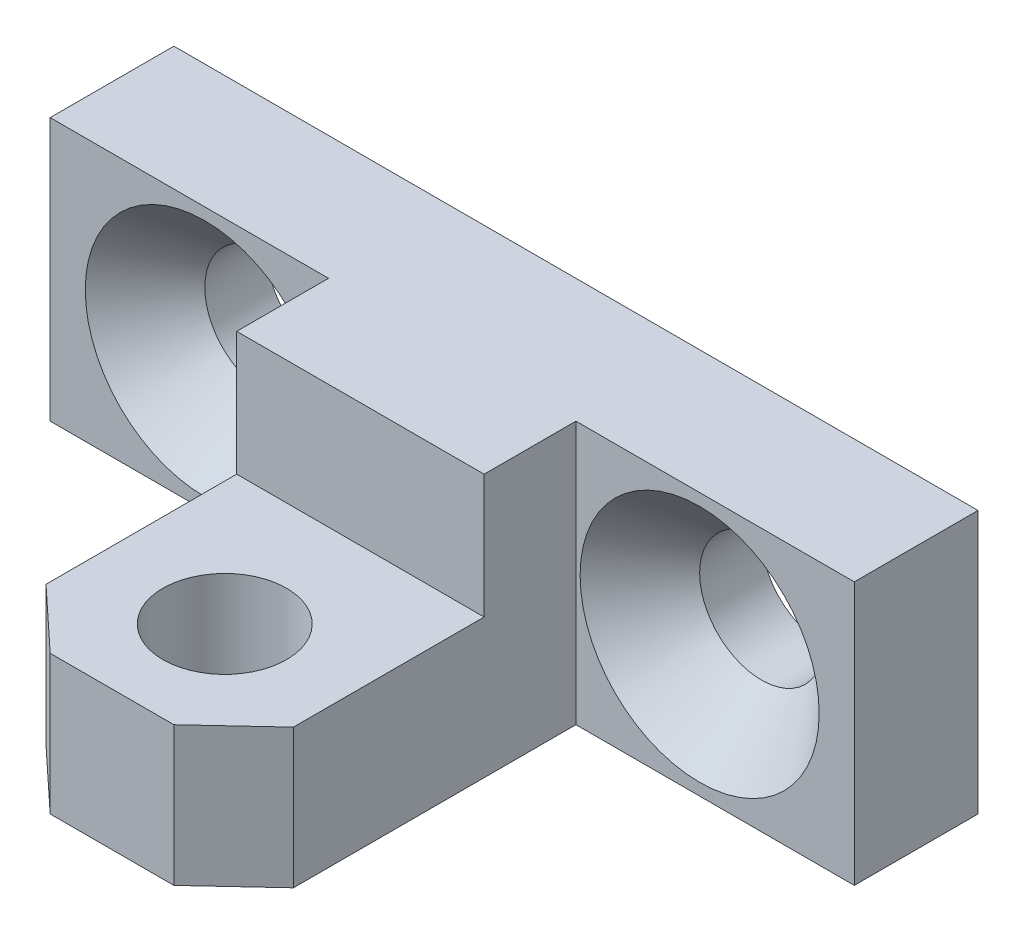
ISO-10303-21;
HEADER;
FILE_DESCRIPTION(('STEP AP214'),'2;1');
FILE_NAME('part.step','',(''),(''),'','','');
FILE_SCHEMA(('AUTOMOTIVE_DESIGN { 1 0 10303 214 1 1 1 1 }'));
ENDSEC;
DATA;
#1=APPLICATION_CONTEXT('core data for automotive mechanical design processes');
#2=APPLICATION_PROTOCOL_DEFINITION('international standard','automotive_design',2000,#1);
#3=PRODUCT_CONTEXT('',#1,'mechanical');
#4=PRODUCT('Part','Part','',(#3));
#5=PRODUCT_RELATED_PRODUCT_CATEGORY('part','',(#4));
#6=PRODUCT_DEFINITION_FORMATION('','',#4);
#7=PRODUCT_DEFINITION_CONTEXT('part definition',#1,'design');
#8=PRODUCT_DEFINITION('design','',#6,#7);
#9=PRODUCT_DEFINITION_SHAPE('','',#8);
#10=(LENGTH_UNIT() NAMED_UNIT(*) SI_UNIT(.MILLI.,.METRE.));
#11=(NAMED_UNIT(*) PLANE_ANGLE_UNIT() SI_UNIT($,.RADIAN.));
#12=(NAMED_UNIT(*) SI_UNIT($,.STERADIAN.) SOLID_ANGLE_UNIT());
#13=UNCERTAINTY_MEASURE_WITH_UNIT(LENGTH_MEASURE(1.E-05),#10,'distance_accuracy_value','');
#14=(GEOMETRIC_REPRESENTATION_CONTEXT(3) GLOBAL_UNCERTAINTY_ASSIGNED_CONTEXT((#13)) GLOBAL_UNIT_ASSIGNED_CONTEXT((#10,
#11,#12)) REPRESENTATION_CONTEXT('',''));
#15=CARTESIAN_POINT('',(0.,0.,0.));
#16=DIRECTION('',(0.,0.,1.));
#17=DIRECTION('',(1.,0.,0.));
#18=AXIS2_PLACEMENT_3D('',#15,#16,#17);
#19=CARTESIAN_POINT('',(0.,-8.5,15.));
#20=DIRECTION('',(0.,0.,1.));
#21=DIRECTION('',(1.,0.,0.));
#22=AXIS2_PLACEMENT_3D('',#19,#20,#21);
#23=PLANE('',#22);
#24=DIRECTION('',(0.,1.,0.));
#25=VECTOR('',#24,1.);
#26=CARTESIAN_POINT('',(15.,0.,15.));
#27=LINE('',#26,#25);
#28=CARTESIAN_POINT('',(15.,-8.5,15.));
#29=VERTEX_POINT('',#28);
#30=CARTESIAN_POINT('',(15.,-4.,15.));
#31=VERTEX_POINT('',#30);
#32=EDGE_CURVE('E202',#29,#31,#27,.T.);
#33=ORIENTED_EDGE('',*,*,#32,.T.);
#34=DIRECTION('',(-1.,0.,0.));
#35=VECTOR('',#34,1.);
#36=CARTESIAN_POINT('',(0.,-4.,15.));
#37=LINE('',#36,#35);
#38=CARTESIAN_POINT('',(11.,-4.,15.));
#39=VERTEX_POINT('',#38);
#40=EDGE_CURVE('E314',#31,#39,#37,.T.);
#41=ORIENTED_EDGE('',*,*,#40,.T.);
#42=DIRECTION('',(0.,-1.,0.));
#43=VECTOR('',#42,1.);
#44=CARTESIAN_POINT('',(11.,-8.5,15.));
#45=LINE('',#44,#43);
#46=CARTESIAN_POINT('',(11.,-8.5,15.));
#47=VERTEX_POINT('',#46);
#48=EDGE_CURVE('E200',#39,#47,#45,.T.);
#49=ORIENTED_EDGE('',*,*,#48,.T.);
#50=DIRECTION('',(1.,0.,0.));
#51=VECTOR('',#50,1.);
#52=CARTESIAN_POINT('',(0.,-8.5,15.));
#53=LINE('',#52,#51);
#54=EDGE_CURVE('E173',#47,#29,#53,.T.);
#55=ORIENTED_EDGE('',*,*,#54,.T.);
#56=EDGE_LOOP('',(#33,#41,#49,#55));
#57=FACE_BOUND('',#56,.T.);
#58=ADVANCED_FACE('F31',(#57),#23,.T.);
#59=CARTESIAN_POINT('',(17.,-20.,13.1349698277247));
#60=DIRECTION('',(0.681998360062498,0.,0.731353701619171));
#61=DIRECTION('',(0.731353701619171,0.,-0.681998360062498));
#62=AXIS2_PLACEMENT_3D('',#59,#60,#61);
#63=PLANE('',#62);
#64=DIRECTION('',(0.,-1.,0.));
#65=VECTOR('',#64,1.);
#66=CARTESIAN_POINT('',(17.,-8.5,13.1349698277247));
#67=LINE('',#66,#65);
#68=CARTESIAN_POINT('',(17.,-4.,13.1349698277247));
#69=VERTEX_POINT('',#68);
#70=CARTESIAN_POINT('',(17.,-8.5,13.1349698277247));
#71=VERTEX_POINT('',#70);
#72=EDGE_CURVE('E195',#69,#71,#67,.T.);
#73=ORIENTED_EDGE('',*,*,#72,.F.);
#74=DIRECTION('',(-0.731353701619171,0.,0.681998360062498));
#75=VECTOR('',#74,1.);
#76=CARTESIAN_POINT('',(17.,-4.,13.1349698277247));
#77=LINE('',#76,#75);
#78=EDGE_CURVE('E311',#69,#31,#77,.T.);
#79=ORIENTED_EDGE('',*,*,#78,.T.);
#80=ORIENTED_EDGE('',*,*,#32,.F.);
#81=DIRECTION('',(-0.731353701619171,0.,0.681998360062498));
#82=VECTOR('',#81,1.);
#83=CARTESIAN_POINT('',(17.,-8.5,13.1349698277247));
#84=LINE('',#83,#82);
#85=EDGE_CURVE('E198',#71,#29,#84,.T.);
#86=ORIENTED_EDGE('',*,*,#85,.F.);
#87=EDGE_LOOP('',(#73,#79,#80,#86));
#88=FACE_BOUND('',#87,.T.);
#89=ADVANCED_FACE('F260',(#88),#63,.T.);
#90=CARTESIAN_POINT('',(9.,-20.,13.1349698277247));
#91=DIRECTION('',(-0.681998360062497,0.,0.731353701619171));
#92=DIRECTION('',(0.731353701619171,0.,0.681998360062497));
#93=AXIS2_PLACEMENT_3D('',#90,#91,#92);
#94=PLANE('',#93);
#95=ORIENTED_EDGE('',*,*,#48,.F.);
#96=DIRECTION('',(-0.731353701619171,0.,-0.681998360062497));
#97=VECTOR('',#96,1.);
#98=CARTESIAN_POINT('',(9.,-4.,13.1349698277247));
#99=LINE('',#98,#97);
#100=CARTESIAN_POINT('',(9.,-4.,13.1349698277247));
#101=VERTEX_POINT('',#100);
#102=EDGE_CURVE('E39',#39,#101,#99,.T.);
#103=ORIENTED_EDGE('',*,*,#102,.T.);
#104=DIRECTION('',(0.,1.,0.));
#105=VECTOR('',#104,1.);
#106=CARTESIAN_POINT('',(9.,0.,13.1349698277247));
#107=LINE('',#106,#105);
#108=CARTESIAN_POINT('',(9.,-8.5,13.1349698277247));
#109=VERTEX_POINT('',#108);
#110=EDGE_CURVE('E205',#109,#101,#107,.T.);
#111=ORIENTED_EDGE('',*,*,#110,.F.);
#112=DIRECTION('',(-0.731353701619171,0.,-0.681998360062497));
#113=VECTOR('',#112,1.);
#114=CARTESIAN_POINT('',(9.,-8.5,13.1349698277247));
#115=LINE('',#114,#113);
#116=EDGE_CURVE('E54',#47,#109,#115,.T.);
#117=ORIENTED_EDGE('',*,*,#116,.F.);
#118=EDGE_LOOP('',(#95,#103,#111,#117));
#119=FACE_BOUND('',#118,.T.);
#120=ADVANCED_FACE('F222',(#119),#94,.T.);
#121=CARTESIAN_POINT('',(0.,0.,15.));
#122=DIRECTION('',(1.,0.,0.));
#123=DIRECTION('',(0.,1.,0.));
#124=AXIS2_PLACEMENT_3D('',#121,#122,#123);
#125=PLANE('',#124);
#126=DIRECTION('',(0.,0.,-1.));
#127=VECTOR('',#126,1.);
#128=CARTESIAN_POINT('',(0.,-8.5,15.));
#129=LINE('',#128,#127);
#130=CARTESIAN_POINT('',(0.,-8.5,4.));
#131=VERTEX_POINT('',#130);
#132=CARTESIAN_POINT('',(0.,-8.5,0.));
#133=VERTEX_POINT('',#132);
#134=EDGE_CURVE('E193',#131,#133,#129,.T.);
#135=ORIENTED_EDGE('',*,*,#134,.F.);
#136=DIRECTION('',(0.,1.,0.));
#137=VECTOR('',#136,1.);
#138=CARTESIAN_POINT('',(0.,-20.,4.));
#139=LINE('',#138,#137);
#140=CARTESIAN_POINT('',(0.,0.,4.));
#141=VERTEX_POINT('',#140);
#142=EDGE_CURVE('E162',#131,#141,#139,.T.);
#143=ORIENTED_EDGE('',*,*,#142,.T.);
#144=DIRECTION('',(0.,0.,-1.));
#145=VECTOR('',#144,1.);
#146=CARTESIAN_POINT('',(0.,0.,15.));
#147=LINE('',#146,#145);
#148=CARTESIAN_POINT('',(0.,0.,0.));
#149=VERTEX_POINT('',#148);
#150=EDGE_CURVE('E176',#141,#149,#147,.T.);
#151=ORIENTED_EDGE('',*,*,#150,.T.);
#152=DIRECTION('',(0.,-1.,0.));
#153=VECTOR('',#152,1.);
#154=CARTESIAN_POINT('',(0.,0.,0.));
#155=LINE('',#154,#153);
#156=EDGE_CURVE('E172',#149,#133,#155,.T.);
#157=ORIENTED_EDGE('',*,*,#156,.T.);
#158=EDGE_LOOP('',(#135,#143,#151,#157));
#159=FACE_BOUND('',#158,.T.);
#160=ADVANCED_FACE('F234',(#159),#125,.F.);
#161=CARTESIAN_POINT('',(0.,-8.5,15.));
#162=DIRECTION('',(0.,1.,0.));
#163=DIRECTION('',(0.,0.,1.));
#164=AXIS2_PLACEMENT_3D('',#161,#162,#163);
#165=PLANE('',#164);
#166=CARTESIAN_POINT('',(13.,-8.5,11.355717768427));
#167=DIRECTION('',(0.,1.,0.));
#168=DIRECTION('',(0.,0.,1.));
#169=AXIS2_PLACEMENT_3D('',#166,#167,#168);
#170=CIRCLE('',#169,2.);
#171=CARTESIAN_POINT('',(13.,-8.5,13.355717768427));
#172=VERTEX_POINT('',#171);
#173=EDGE_CURVE('E137',#172,#172,#170,.T.);
#174=ORIENTED_EDGE('',*,*,#173,.T.);
#175=EDGE_LOOP('',(#174));
#176=FACE_BOUND('',#175,.T.);
#177=DIRECTION('',(0.,0.,1.));
#178=VECTOR('',#177,1.);
#179=CARTESIAN_POINT('',(17.,-8.5,15.));
#180=LINE('',#179,#178);
#181=CARTESIAN_POINT('',(17.,-8.5,4.));
#182=VERTEX_POINT('',#181);
#183=EDGE_CURVE('E151',#182,#71,#180,.T.);
#184=ORIENTED_EDGE('',*,*,#183,.T.);
#185=ORIENTED_EDGE('',*,*,#85,.T.);
#186=ORIENTED_EDGE('',*,*,#54,.F.);
#187=ORIENTED_EDGE('',*,*,#116,.T.);
#188=DIRECTION('',(0.,0.,-1.));
#189=VECTOR('',#188,1.);
#190=CARTESIAN_POINT('',(9.,-8.5,15.));
#191=LINE('',#190,#189);
#192=CARTESIAN_POINT('',(9.,-8.5,4.));
#193=VERTEX_POINT('',#192);
#194=EDGE_CURVE('E165',#109,#193,#191,.T.);
#195=ORIENTED_EDGE('',*,*,#194,.T.);
#196=DIRECTION('',(-1.,0.,0.));
#197=VECTOR('',#196,1.);
#198=CARTESIAN_POINT('',(0.,-8.5,4.));
#199=LINE('',#198,#197);
#200=EDGE_CURVE('E169',#193,#131,#199,.T.);
#201=ORIENTED_EDGE('',*,*,#200,.T.);
#202=ORIENTED_EDGE('',*,*,#134,.T.);
#203=DIRECTION('',(1.,0.,0.));
#204=VECTOR('',#203,1.);
#205=CARTESIAN_POINT('',(0.,-8.5,0.));
#206=LINE('',#205,#204);
#207=CARTESIAN_POINT('',(26.,-8.5,0.));
#208=VERTEX_POINT('',#207);
#209=EDGE_CURVE('E180',#133,#208,#206,.T.);
#210=ORIENTED_EDGE('',*,*,#209,.T.);
#211=DIRECTION('',(0.,0.,-1.));
#212=VECTOR('',#211,1.);
#213=CARTESIAN_POINT('',(26.,-8.5,15.));
#214=LINE('',#213,#212);
#215=CARTESIAN_POINT('',(26.,-8.5,4.));
#216=VERTEX_POINT('',#215);
#217=EDGE_CURVE('E191',#216,#208,#214,.T.);
#218=ORIENTED_EDGE('',*,*,#217,.F.);
#219=DIRECTION('',(-1.,0.,0.));
#220=VECTOR('',#219,1.);
#221=CARTESIAN_POINT('',(0.,-8.5,4.));
#222=LINE('',#221,#220);
#223=EDGE_CURVE('E155',#216,#182,#222,.T.);
#224=ORIENTED_EDGE('',*,*,#223,.T.);
#225=EDGE_LOOP('',(#184,#185,#186,#187,#195,#201,#202,#210,#218,#224));
#226=FACE_BOUND('',#225,.T.);
#227=ADVANCED_FACE('F228',(#176,#226),#165,.F.);
#228=CARTESIAN_POINT('',(26.,0.,15.));
#229=DIRECTION('',(-1.,0.,0.));
#230=DIRECTION('',(0.,-1.,0.));
#231=AXIS2_PLACEMENT_3D('',#228,#229,#230);
#232=PLANE('',#231);
#233=DIRECTION('',(0.,0.,-1.));
#234=VECTOR('',#233,1.);
#235=CARTESIAN_POINT('',(26.,0.,15.));
#236=LINE('',#235,#234);
#237=CARTESIAN_POINT('',(26.,0.,4.));
#238=VERTEX_POINT('',#237);
#239=CARTESIAN_POINT('',(26.,0.,0.));
#240=VERTEX_POINT('',#239);
#241=EDGE_CURVE('E189',#238,#240,#236,.T.);
#242=ORIENTED_EDGE('',*,*,#241,.F.);
#243=DIRECTION('',(0.,1.,0.));
#244=VECTOR('',#243,1.);
#245=CARTESIAN_POINT('',(26.,-20.,4.));
#246=LINE('',#245,#244);
#247=EDGE_CURVE('E145',#216,#238,#246,.T.);
#248=ORIENTED_EDGE('',*,*,#247,.F.);
#249=ORIENTED_EDGE('',*,*,#217,.T.);
#250=DIRECTION('',(0.,1.,0.));
#251=VECTOR('',#250,1.);
#252=CARTESIAN_POINT('',(26.,0.,0.));
#253=LINE('',#252,#251);
#254=EDGE_CURVE('E183',#208,#240,#253,.T.);
#255=ORIENTED_EDGE('',*,*,#254,.T.);
#256=EDGE_LOOP('',(#242,#248,#249,#255));
#257=FACE_BOUND('',#256,.T.);
#258=ADVANCED_FACE('F245',(#257),#232,.F.);
#259=CARTESIAN_POINT('',(0.,0.,15.));
#260=DIRECTION('',(0.,-1.,0.));
#261=DIRECTION('',(0.,0.,-1.));
#262=AXIS2_PLACEMENT_3D('',#259,#260,#261);
#263=PLANE('',#262);
#264=DIRECTION('',(0.,0.,-1.));
#265=VECTOR('',#264,1.);
#266=CARTESIAN_POINT('',(9.,0.,4.));
#267=LINE('',#266,#265);
#268=CARTESIAN_POINT('',(9.,0.,6.96884599809584));
#269=VERTEX_POINT('',#268);
#270=CARTESIAN_POINT('',(9.,0.,4.));
#271=VERTEX_POINT('',#270);
#272=EDGE_CURVE('E136',#269,#271,#267,.T.);
#273=ORIENTED_EDGE('',*,*,#272,.F.);
#274=DIRECTION('',(-1.,0.,0.));
#275=VECTOR('',#274,1.);
#276=CARTESIAN_POINT('',(7.38962932984977,0.,6.96884599809584));
#277=LINE('',#276,#275);
#278=CARTESIAN_POINT('',(17.,0.,6.96884599809584));
#279=VERTEX_POINT('',#278);
#280=EDGE_CURVE('E123',#279,#269,#277,.T.);
#281=ORIENTED_EDGE('',*,*,#280,.F.);
#282=DIRECTION('',(0.,0.,1.));
#283=VECTOR('',#282,1.);
#284=CARTESIAN_POINT('',(17.,0.,4.));
#285=LINE('',#284,#283);
#286=CARTESIAN_POINT('',(17.,0.,4.));
#287=VERTEX_POINT('',#286);
#288=EDGE_CURVE('E134',#287,#279,#285,.T.);
#289=ORIENTED_EDGE('',*,*,#288,.F.);
#290=DIRECTION('',(-1.,0.,0.));
#291=VECTOR('',#290,1.);
#292=CARTESIAN_POINT('',(26.,0.,4.));
#293=LINE('',#292,#291);
#294=EDGE_CURVE('E143',#238,#287,#293,.T.);
#295=ORIENTED_EDGE('',*,*,#294,.F.);
#296=ORIENTED_EDGE('',*,*,#241,.T.);
#297=DIRECTION('',(-1.,0.,0.));
#298=VECTOR('',#297,1.);
#299=CARTESIAN_POINT('',(0.,0.,0.));
#300=LINE('',#299,#298);
#301=EDGE_CURVE('E177',#240,#149,#300,.T.);
#302=ORIENTED_EDGE('',*,*,#301,.T.);
#303=ORIENTED_EDGE('',*,*,#150,.F.);
#304=DIRECTION('',(-1.,0.,0.));
#305=VECTOR('',#304,1.);
#306=CARTESIAN_POINT('',(0.,0.,4.));
#307=LINE('',#306,#305);
#308=EDGE_CURVE('E159',#271,#141,#307,.T.);
#309=ORIENTED_EDGE('',*,*,#308,.F.);
#310=EDGE_LOOP('',(#273,#281,#289,#295,#296,#302,#303,#309));
#311=FACE_BOUND('',#310,.T.);
#312=ADVANCED_FACE('F132',(#311),#263,.F.);
#313=CARTESIAN_POINT('',(0.,-8.5,0.));
#314=DIRECTION('',(0.,0.,1.));
#315=DIRECTION('',(1.,0.,0.));
#316=AXIS2_PLACEMENT_3D('',#313,#314,#315);
#317=PLANE('',#316);
#318=CARTESIAN_POINT('',(5.00000000000001,-4.25150177680197,0.));
#319=DIRECTION('',(0.,0.,-1.));
#320=DIRECTION('',(-1.,0.,0.));
#321=AXIS2_PLACEMENT_3D('',#318,#319,#320);
#322=CIRCLE('',#321,2.);
#323=CARTESIAN_POINT('',(3.00000000000001,-4.25150177680197,0.));
#324=VERTEX_POINT('',#323);
#325=EDGE_CURVE('E303',#324,#324,#322,.T.);
#326=ORIENTED_EDGE('',*,*,#325,.F.);
#327=EDGE_LOOP('',(#326));
#328=FACE_BOUND('',#327,.T.);
#329=CARTESIAN_POINT('',(21.,-4.25000000119887,0.));
#330=DIRECTION('',(0.,0.,-1.));
#331=DIRECTION('',(-1.,0.,0.));
#332=AXIS2_PLACEMENT_3D('',#329,#330,#331);
#333=CIRCLE('',#332,2.);
#334=CARTESIAN_POINT('',(19.,-4.25000000119887,0.));
#335=VERTEX_POINT('',#334);
#336=EDGE_CURVE('E147',#335,#335,#333,.T.);
#337=ORIENTED_EDGE('',*,*,#336,.F.);
#338=EDGE_LOOP('',(#337));
#339=FACE_BOUND('',#338,.T.);
#340=ORIENTED_EDGE('',*,*,#156,.F.);
#341=ORIENTED_EDGE('',*,*,#301,.F.);
#342=ORIENTED_EDGE('',*,*,#254,.F.);
#343=ORIENTED_EDGE('',*,*,#209,.F.);
#344=EDGE_LOOP('',(#340,#341,#342,#343));
#345=FACE_BOUND('',#344,.T.);
#346=ADVANCED_FACE('F241',(#328,#339,#345),#317,.F.);
#347=CARTESIAN_POINT('',(0.,-20.,4.));
#348=DIRECTION('',(0.,0.,-1.));
#349=DIRECTION('',(-1.,0.,0.));
#350=AXIS2_PLACEMENT_3D('',#347,#348,#349);
#351=PLANE('',#350);
#352=CARTESIAN_POINT('',(5.00000000000001,-4.25150177680197,4.));
#353=DIRECTION('',(0.,0.,-1.));
#354=DIRECTION('',(-1.,0.,0.));
#355=AXIS2_PLACEMENT_3D('',#352,#353,#354);
#356=CIRCLE('',#355,3.86503017227532);
#357=CARTESIAN_POINT('',(1.13496982772469,-4.25150177680197,4.));
#358=VERTEX_POINT('',#357);
#359=EDGE_CURVE('E214',#358,#358,#356,.T.);
#360=ORIENTED_EDGE('',*,*,#359,.T.);
#361=EDGE_LOOP('',(#360));
#362=FACE_BOUND('',#361,.T.);
#363=DIRECTION('',(0.,1.,0.));
#364=VECTOR('',#363,1.);
#365=CARTESIAN_POINT('',(9.,-20.,4.));
#366=LINE('',#365,#364);
#367=EDGE_CURVE('E161',#193,#271,#366,.T.);
#368=ORIENTED_EDGE('',*,*,#367,.T.);
#369=ORIENTED_EDGE('',*,*,#308,.T.);
#370=ORIENTED_EDGE('',*,*,#142,.F.);
#371=ORIENTED_EDGE('',*,*,#200,.F.);
#372=EDGE_LOOP('',(#368,#369,#370,#371));
#373=FACE_BOUND('',#372,.T.);
#374=ADVANCED_FACE('F231',(#362,#373),#351,.F.);
#375=CARTESIAN_POINT('',(9.,-20.,4.));
#376=DIRECTION('',(1.,0.,0.));
#377=DIRECTION('',(0.,0.,-1.));
#378=AXIS2_PLACEMENT_3D('',#375,#376,#377);
#379=PLANE('',#378);
#380=DIRECTION('',(0.,0.,1.));
#381=VECTOR('',#380,1.);
#382=CARTESIAN_POINT('',(9.,-4.,4.));
#383=LINE('',#382,#381);
#384=CARTESIAN_POINT('',(9.,-4.,6.96884599809584));
#385=VERTEX_POINT('',#384);
#386=EDGE_CURVE('E46',#385,#101,#383,.T.);
#387=ORIENTED_EDGE('',*,*,#386,.F.);
#388=DIRECTION('',(0.,1.,0.));
#389=VECTOR('',#388,1.);
#390=CARTESIAN_POINT('',(9.,-20.,6.96884599809584));
#391=LINE('',#390,#389);
#392=EDGE_CURVE('E305',#385,#269,#391,.T.);
#393=ORIENTED_EDGE('',*,*,#392,.T.);
#394=ORIENTED_EDGE('',*,*,#272,.T.);
#395=ORIENTED_EDGE('',*,*,#367,.F.);
#396=ORIENTED_EDGE('',*,*,#194,.F.);
#397=ORIENTED_EDGE('',*,*,#110,.T.);
#398=EDGE_LOOP('',(#387,#393,#394,#395,#396,#397));
#399=FACE_BOUND('',#398,.T.);
#400=ADVANCED_FACE('F225',(#399),#379,.F.);
#401=CARTESIAN_POINT('',(26.,-20.,4.));
#402=DIRECTION('',(0.,0.,-1.));
#403=DIRECTION('',(-1.,0.,0.));
#404=AXIS2_PLACEMENT_3D('',#401,#402,#403);
#405=PLANE('',#404);
#406=CARTESIAN_POINT('',(21.,-4.25000000119887,4.));
#407=DIRECTION('',(0.,0.,-1.));
#408=DIRECTION('',(-1.,0.,0.));
#409=AXIS2_PLACEMENT_3D('',#406,#407,#408);
#410=CIRCLE('',#409,3.86503017227532);
#411=CARTESIAN_POINT('',(17.1349698277247,-4.25000000119887,4.));
#412=VERTEX_POINT('',#411);
#413=EDGE_CURVE('E208',#412,#412,#410,.T.);
#414=ORIENTED_EDGE('',*,*,#413,.T.);
#415=EDGE_LOOP('',(#414));
#416=FACE_BOUND('',#415,.T.);
#417=ORIENTED_EDGE('',*,*,#247,.T.);
#418=ORIENTED_EDGE('',*,*,#294,.T.);
#419=DIRECTION('',(0.,1.,0.));
#420=VECTOR('',#419,1.);
#421=CARTESIAN_POINT('',(17.,-20.,4.));
#422=LINE('',#421,#420);
#423=EDGE_CURVE('E141',#182,#287,#422,.T.);
#424=ORIENTED_EDGE('',*,*,#423,.F.);
#425=ORIENTED_EDGE('',*,*,#223,.F.);
#426=EDGE_LOOP('',(#417,#418,#424,#425));
#427=FACE_BOUND('',#426,.T.);
#428=ADVANCED_FACE('F247',(#416,#427),#405,.F.);
#429=CARTESIAN_POINT('',(17.,-20.,4.));
#430=DIRECTION('',(-1.,0.,0.));
#431=DIRECTION('',(0.,0.,1.));
#432=AXIS2_PLACEMENT_3D('',#429,#430,#431);
#433=PLANE('',#432);
#434=ORIENTED_EDGE('',*,*,#288,.T.);
#435=DIRECTION('',(0.,-1.,0.));
#436=VECTOR('',#435,1.);
#437=CARTESIAN_POINT('',(17.,-20.,6.96884599809584));
#438=LINE('',#437,#436);
#439=CARTESIAN_POINT('',(17.,-4.,6.96884599809584));
#440=VERTEX_POINT('',#439);
#441=EDGE_CURVE('E11',#279,#440,#438,.T.);
#442=ORIENTED_EDGE('',*,*,#441,.T.);
#443=DIRECTION('',(0.,0.,-1.));
#444=VECTOR('',#443,1.);
#445=CARTESIAN_POINT('',(17.,-4.,4.));
#446=LINE('',#445,#444);
#447=EDGE_CURVE('E309',#69,#440,#446,.T.);
#448=ORIENTED_EDGE('',*,*,#447,.F.);
#449=ORIENTED_EDGE('',*,*,#72,.T.);
#450=ORIENTED_EDGE('',*,*,#183,.F.);
#451=ORIENTED_EDGE('',*,*,#423,.T.);
#452=EDGE_LOOP('',(#434,#442,#448,#449,#450,#451));
#453=FACE_BOUND('',#452,.T.);
#454=ADVANCED_FACE('F139',(#453),#433,.F.);
#455=CARTESIAN_POINT('',(21.,-4.25000000119887,15.));
#456=DIRECTION('',(0.,0.,-1.));
#457=DIRECTION('',(-1.,0.,0.));
#458=AXIS2_PLACEMENT_3D('',#455,#456,#457);
#459=CYLINDRICAL_SURFACE('',#458,2.);
#460=CARTESIAN_POINT('',(21.,-4.25000000119887,2.));
#461=DIRECTION('',(0.,0.,-1.));
#462=DIRECTION('',(-1.,0.,0.));
#463=AXIS2_PLACEMENT_3D('',#460,#461,#462);
#464=CIRCLE('',#463,2.);
#465=CARTESIAN_POINT('',(19.,-4.25000000119887,2.));
#466=VERTEX_POINT('',#465);
#467=EDGE_CURVE('E211',#466,#466,#464,.F.);
#468=ORIENTED_EDGE('',*,*,#467,.T.);
#469=EDGE_LOOP('',(#468));
#470=FACE_BOUND('',#469,.T.);
#471=ORIENTED_EDGE('',*,*,#336,.T.);
#472=EDGE_LOOP('',(#471));
#473=FACE_BOUND('',#472,.T.);
#474=ADVANCED_FACE('F255',(#470,#473),#459,.F.);
#475=CARTESIAN_POINT('',(5.00000000000001,-4.25150177680197,15.));
#476=DIRECTION('',(0.,0.,-1.));
#477=DIRECTION('',(-1.,0.,0.));
#478=AXIS2_PLACEMENT_3D('',#475,#476,#477);
#479=CYLINDRICAL_SURFACE('',#478,2.);
#480=CARTESIAN_POINT('',(5.00000000000001,-4.25150177680197,2.));
#481=DIRECTION('',(0.,0.,-1.));
#482=DIRECTION('',(-1.,0.,0.));
#483=AXIS2_PLACEMENT_3D('',#480,#481,#482);
#484=CIRCLE('',#483,2.);
#485=CARTESIAN_POINT('',(3.00000000000001,-4.25150177680197,2.));
#486=VERTEX_POINT('',#485);
#487=EDGE_CURVE('E217',#486,#486,#484,.F.);
#488=ORIENTED_EDGE('',*,*,#487,.T.);
#489=EDGE_LOOP('',(#488));
#490=FACE_BOUND('',#489,.T.);
#491=ORIENTED_EDGE('',*,*,#325,.T.);
#492=EDGE_LOOP('',(#491));
#493=FACE_BOUND('',#492,.T.);
#494=ADVANCED_FACE('F284',(#490,#493),#479,.F.);
#495=CARTESIAN_POINT('',(21.,-4.25000000119887,4.));
#496=DIRECTION('',(0.,0.,1.));
#497=DIRECTION('',(1.,0.,0.));
#498=AXIS2_PLACEMENT_3D('',#495,#496,#497);
#499=CONICAL_SURFACE('',#498,3.86503017227532,0.75049157835756);
#500=ORIENTED_EDGE('',*,*,#467,.F.);
#501=EDGE_LOOP('',(#500));
#502=FACE_BOUND('',#501,.T.);
#503=ORIENTED_EDGE('',*,*,#413,.F.);
#504=EDGE_LOOP('',(#503));
#505=FACE_BOUND('',#504,.T.);
#506=ADVANCED_FACE('F282',(#502,#505),#499,.F.);
#507=CARTESIAN_POINT('',(5.00000000000001,-4.25150177680197,4.));
#508=DIRECTION('',(0.,0.,1.));
#509=DIRECTION('',(1.,0.,0.));
#510=AXIS2_PLACEMENT_3D('',#507,#508,#509);
#511=CONICAL_SURFACE('',#510,3.86503017227532,0.75049157835756);
#512=ORIENTED_EDGE('',*,*,#487,.F.);
#513=EDGE_LOOP('',(#512));
#514=FACE_BOUND('',#513,.T.);
#515=ORIENTED_EDGE('',*,*,#359,.F.);
#516=EDGE_LOOP('',(#515));
#517=FACE_BOUND('',#516,.T.);
#518=ADVANCED_FACE('F33',(#514,#517),#511,.F.);
#519=CARTESIAN_POINT('',(7.38962932984977,-4.,6.96884599809584));
#520=DIRECTION('',(0.,0.,-1.));
#521=DIRECTION('',(-1.,0.,0.));
#522=AXIS2_PLACEMENT_3D('',#519,#520,#521);
#523=PLANE('',#522);
#524=DIRECTION('',(-1.,0.,0.));
#525=VECTOR('',#524,1.);
#526=CARTESIAN_POINT('',(7.38962932984977,-4.,6.96884599809584));
#527=LINE('',#526,#525);
#528=EDGE_CURVE('E125',#440,#385,#527,.T.);
#529=ORIENTED_EDGE('',*,*,#528,.F.);
#530=ORIENTED_EDGE('',*,*,#441,.F.);
#531=ORIENTED_EDGE('',*,*,#280,.T.);
#532=ORIENTED_EDGE('',*,*,#392,.F.);
#533=EDGE_LOOP('',(#529,#530,#531,#532));
#534=FACE_BOUND('',#533,.T.);
#535=ADVANCED_FACE('F122',(#534),#523,.F.);
#536=CARTESIAN_POINT('',(7.38962932984977,-4.,15.8517423292531));
#537=DIRECTION('',(0.,1.,0.));
#538=DIRECTION('',(0.,0.,1.));
#539=AXIS2_PLACEMENT_3D('',#536,#537,#538);
#540=PLANE('',#539);
#541=CARTESIAN_POINT('',(13.,-4.,11.355717768427));
#542=DIRECTION('',(0.,1.,0.));
#543=DIRECTION('',(0.,0.,1.));
#544=AXIS2_PLACEMENT_3D('',#541,#542,#543);
#545=CIRCLE('',#544,2.);
#546=CARTESIAN_POINT('',(13.,-4.,13.355717768427));
#547=VERTEX_POINT('',#546);
#548=EDGE_CURVE('E318',#547,#547,#545,.T.);
#549=ORIENTED_EDGE('',*,*,#548,.F.);
#550=EDGE_LOOP('',(#549));
#551=FACE_BOUND('',#550,.T.);
#552=ORIENTED_EDGE('',*,*,#447,.T.);
#553=ORIENTED_EDGE('',*,*,#528,.T.);
#554=ORIENTED_EDGE('',*,*,#386,.T.);
#555=ORIENTED_EDGE('',*,*,#102,.F.);
#556=ORIENTED_EDGE('',*,*,#40,.F.);
#557=ORIENTED_EDGE('',*,*,#78,.F.);
#558=EDGE_LOOP('',(#552,#553,#554,#555,#556,#557));
#559=FACE_BOUND('',#558,.T.);
#560=ADVANCED_FACE('F327',(#551,#559),#540,.T.);
#561=CARTESIAN_POINT('',(13.,-8.5,11.355717768427));
#562=DIRECTION('',(0.,1.,0.));
#563=DIRECTION('',(0.,0.,1.));
#564=AXIS2_PLACEMENT_3D('',#561,#562,#563);
#565=CYLINDRICAL_SURFACE('',#564,2.);
#566=ORIENTED_EDGE('',*,*,#173,.F.);
#567=EDGE_LOOP('',(#566));
#568=FACE_BOUND('',#567,.T.);
#569=ORIENTED_EDGE('',*,*,#548,.T.);
#570=EDGE_LOOP('',(#569));
#571=FACE_BOUND('',#570,.T.);
#572=ADVANCED_FACE('F324',(#568,#571),#565,.F.);
#573=CLOSED_SHELL('',(#58,#89,#120,#160,#227,#258,#312,#346,#374,#400,#428,#454,#474,#494,#506,
#518,#535,#560,#572));
#574=MANIFOLD_SOLID_BREP('B2',#573);
#575=ADVANCED_BREP_SHAPE_REPRESENTATION('',(#18,#574),#14);
#576=SHAPE_DEFINITION_REPRESENTATION(#9,#575);
ENDSEC;
END-ISO-10303-21;
